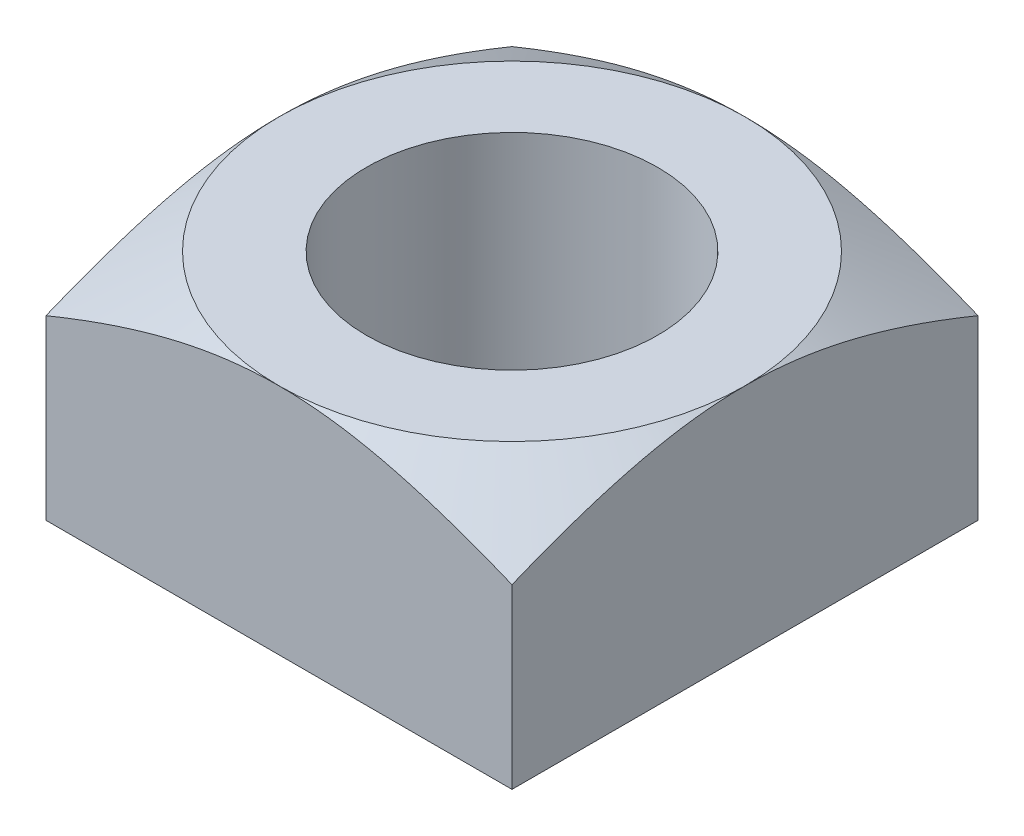
ISO-10303-21;
HEADER;
FILE_DESCRIPTION(('STEP AP214'),'2;1');
FILE_NAME('part.step','',(''),(''),'','','');
FILE_SCHEMA(('AUTOMOTIVE_DESIGN { 1 0 10303 214 1 1 1 1 }'));
ENDSEC;
DATA;
#1=APPLICATION_CONTEXT('core data for automotive mechanical design processes');
#2=APPLICATION_PROTOCOL_DEFINITION('international standard','automotive_design',2000,#1);
#3=PRODUCT_CONTEXT('',#1,'mechanical');
#4=PRODUCT('Part','Part','',(#3));
#5=PRODUCT_RELATED_PRODUCT_CATEGORY('part','',(#4));
#6=PRODUCT_DEFINITION_FORMATION('','',#4);
#7=PRODUCT_DEFINITION_CONTEXT('part definition',#1,'design');
#8=PRODUCT_DEFINITION('design','',#6,#7);
#9=PRODUCT_DEFINITION_SHAPE('','',#8);
#10=(LENGTH_UNIT() NAMED_UNIT(*) SI_UNIT(.MILLI.,.METRE.));
#11=(NAMED_UNIT(*) PLANE_ANGLE_UNIT() SI_UNIT($,.RADIAN.));
#12=(NAMED_UNIT(*) SI_UNIT($,.STERADIAN.) SOLID_ANGLE_UNIT());
#13=UNCERTAINTY_MEASURE_WITH_UNIT(LENGTH_MEASURE(1.E-05),#10,'distance_accuracy_value','');
#14=(GEOMETRIC_REPRESENTATION_CONTEXT(3) GLOBAL_UNCERTAINTY_ASSIGNED_CONTEXT((#13)) GLOBAL_UNIT_ASSIGNED_CONTEXT((#10,
#11,#12)) REPRESENTATION_CONTEXT('',''));
#15=CARTESIAN_POINT('',(0.,0.,0.));
#16=DIRECTION('',(0.,0.,1.));
#17=DIRECTION('',(1.,0.,0.));
#18=AXIS2_PLACEMENT_3D('',#15,#16,#17);
#19=CARTESIAN_POINT('',(-4.,2.,4.));
#20=DIRECTION('',(0.,1.,0.));
#21=DIRECTION('',(0.,0.,1.));
#22=AXIS2_PLACEMENT_3D('',#19,#20,#21);
#23=PLANE('',#22);
#24=CARTESIAN_POINT('',(0.,2.,0.));
#25=DIRECTION('',(0.,1.,0.));
#26=DIRECTION('',(0.,0.,1.));
#27=AXIS2_PLACEMENT_3D('',#24,#25,#26);
#28=CIRCLE('',#27,2.5);
#29=CARTESIAN_POINT('',(0.,2.,2.5));
#30=VERTEX_POINT('',#29);
#31=EDGE_CURVE('E171',#30,#30,#28,.T.);
#32=ORIENTED_EDGE('',*,*,#31,.F.);
#33=EDGE_LOOP('',(#32));
#34=FACE_BOUND('',#33,.T.);
#35=CARTESIAN_POINT('',(0.,2.,0.));
#36=DIRECTION('',(0.,1.,0.));
#37=DIRECTION('',(0.,0.,1.));
#38=AXIS2_PLACEMENT_3D('',#35,#36,#37);
#39=CIRCLE('',#38,4.);
#40=CARTESIAN_POINT('',(-4.,2.,0.));
#41=VERTEX_POINT('',#40);
#42=CARTESIAN_POINT('',(0.,2.,4.));
#43=VERTEX_POINT('',#42);
#44=EDGE_CURVE('E91',#41,#43,#39,.T.);
#45=ORIENTED_EDGE('',*,*,#44,.T.);
#46=CARTESIAN_POINT('',(4.,2.,0.));
#47=VERTEX_POINT('',#46);
#48=EDGE_CURVE('E104',#43,#47,#39,.T.);
#49=ORIENTED_EDGE('',*,*,#48,.T.);
#50=CARTESIAN_POINT('',(0.,2.,-4.));
#51=VERTEX_POINT('',#50);
#52=EDGE_CURVE('E55',#47,#51,#39,.T.);
#53=ORIENTED_EDGE('',*,*,#52,.T.);
#54=EDGE_CURVE('E102',#51,#41,#39,.T.);
#55=ORIENTED_EDGE('',*,*,#54,.T.);
#56=EDGE_LOOP('',(#45,#49,#53,#55));
#57=FACE_BOUND('',#56,.T.);
#58=ADVANCED_FACE('F34',(#34,#57),#23,.T.);
#59=CARTESIAN_POINT('',(-4.,2.,-4.));
#60=DIRECTION('',(1.,0.,0.));
#61=DIRECTION('',(0.,0.,-1.));
#62=AXIS2_PLACEMENT_3D('',#59,#60,#61);
#63=PLANE('',#62);
#64=CARTESIAN_POINT('',(-4.,-0.879608531474339,-8.04844470335721));
#65=CARTESIAN_POINT('',(-4.,-0.778376701369592,-7.85261592056263));
#66=CARTESIAN_POINT('',(-4.,-0.677698114220098,-7.65649840863444));
#67=CARTESIAN_POINT('',(-4.,-0.477741963836189,-7.26353623014899));
#68=CARTESIAN_POINT('',(-4.,-0.37846448419485,-7.06669152108224));
#69=CARTESIAN_POINT('',(-4.,-0.181400070838561,-6.6717133201506));
#70=CARTESIAN_POINT('',(-4.,-0.0836169082704405,-6.47357794319027));
#71=CARTESIAN_POINT('',(-4.,0.109812034269089,-6.07627012713316));
#72=CARTESIAN_POINT('',(-4.,0.205457860585533,-5.87709771063875));
#73=CARTESIAN_POINT('',(-4.,0.399409356430036,-5.4661603663151));
#74=CARTESIAN_POINT('',(-4.,0.497558644796761,-5.25432139860768));
#75=CARTESIAN_POINT('',(-4.,0.689977135565198,-4.82889037773953));
#76=CARTESIAN_POINT('',(-4.,0.784246474471973,-4.61529838657165));
#77=CARTESIAN_POINT('',(-4.,0.967619358116517,-4.18609032729127));
#78=CARTESIAN_POINT('',(-4.,1.05672683142684,-3.9704759475457));
#79=CARTESIAN_POINT('',(-4.,1.22814880888423,-3.53657908239381));
#80=CARTESIAN_POINT('',(-4.,1.31046434544991,-3.31829700830738));
#81=CARTESIAN_POINT('',(-4.,1.46507491133827,-2.88099068520034));
#82=CARTESIAN_POINT('',(-4.,1.53747418675627,-2.66200376564764));
#83=CARTESIAN_POINT('',(-4.,1.67030446821941,-2.22036511787923));
#84=CARTESIAN_POINT('',(-4.,1.73073501671771,-1.9977132499102));
#85=CARTESIAN_POINT('',(-4.,1.83475405028804,-1.55305317277863));
#86=CARTESIAN_POINT('',(-4.,1.87865359831472,-1.33112023441745));
#87=CARTESIAN_POINT('',(-4.,1.93028974853736,-0.996056175139629));
#88=CARTESIAN_POINT('',(-4.,1.94513315761965,-0.884004148426962));
#89=CARTESIAN_POINT('',(-4.,1.96970161537044,-0.65934524594728));
#90=CARTESIAN_POINT('',(-4.,1.97942719778781,-0.546738429277365));
#91=CARTESIAN_POINT('',(-4.,1.99506673996849,-0.295543207308193));
#92=CARTESIAN_POINT('',(-4.,1.99961194835245,-0.156866727763163));
#93=CARTESIAN_POINT('',(-4.,2.00034035778429,0.120511009690021));
#94=CARTESIAN_POINT('',(-4.,1.99652325333162,0.259212268318327));
#95=CARTESIAN_POINT('',(-4.,1.98070472899033,0.536169638038163));
#96=CARTESIAN_POINT('',(-4.,1.96870164439033,0.674425652837391));
#97=CARTESIAN_POINT('',(-4.,1.93703631512156,0.950050352308859));
#98=CARTESIAN_POINT('',(-4.,1.91737381357289,1.08741900706391));
#99=CARTESIAN_POINT('',(-4.,1.87050134979361,1.36484136719974));
#100=CARTESIAN_POINT('',(-4.,1.84309394385382,1.50486135967658));
#101=CARTESIAN_POINT('',(-4.,1.78193523290573,1.78349774950432));
#102=CARTESIAN_POINT('',(-4.,1.74818376311245,1.92211411029776));
#103=CARTESIAN_POINT('',(-4.,1.67526235990367,2.19797968288363));
#104=CARTESIAN_POINT('',(-4.,1.63608962559682,2.33522814840535));
#105=CARTESIAN_POINT('',(-4.,1.55320237253521,2.60832741297954));
#106=CARTESIAN_POINT('',(-4.,1.50948810915175,2.74417829014716));
#107=CARTESIAN_POINT('',(-4.,1.38125316333318,3.12438990812551));
#108=CARTESIAN_POINT('',(-4.,1.29241881266137,3.36729411498807));
#109=CARTESIAN_POINT('',(-4.,1.1058586112881,3.84968473428652));
#110=CARTESIAN_POINT('',(-4.,1.00813024129503,4.08917015596606));
#111=CARTESIAN_POINT('',(-4.,0.806130641916596,4.56561728677685));
#112=CARTESIAN_POINT('',(-4.,0.701853313168632,4.80257639543188));
#113=CARTESIAN_POINT('',(-4.,0.488546186181498,5.2743029818423));
#114=CARTESIAN_POINT('',(-4.,0.379516895331731,5.50907069034952));
#115=CARTESIAN_POINT('',(-4.,0.157520077786945,5.97765144265674));
#116=CARTESIAN_POINT('',(-4.,0.0445410635400105,6.21145902625167));
#117=CARTESIAN_POINT('',(-4.,-0.184181615923029,6.6777207729866));
#118=CARTESIAN_POINT('',(-4.,-0.29992534116102,6.91017490660669));
#119=CARTESIAN_POINT('',(-4.,-0.533502302055754,7.37387019318965));
#120=CARTESIAN_POINT('',(-4.,-0.651334363961229,7.6051119384375));
#121=CARTESIAN_POINT('',(-4.,-0.888706138440968,8.06671795863904));
#122=CARTESIAN_POINT('',(-4.,-1.0082458624046,8.29708222772734));
#123=CARTESIAN_POINT('',(-4.,-1.33646623253675,8.92502953226765));
#124=CARTESIAN_POINT('',(-4.,-1.54650701473723,9.32190130659233));
#125=CARTESIAN_POINT('',(-4.,-1.96949835553763,10.1141646760743));
#126=CARTESIAN_POINT('',(-4.,-2.18244935296364,10.5095560362915));
#127=CARTESIAN_POINT('',(-4.,-2.60904017286627,11.2965845761741));
#128=CARTESIAN_POINT('',(-4.,-2.82266611728943,11.6882292868062));
#129=CARTESIAN_POINT('',(-4.,-3.25147621645828,12.470575594474));
#130=CARTESIAN_POINT('',(-4.,-3.46666009056688,12.8612773452552));
#131=CARTESIAN_POINT('',(-4.,-3.68240128464964,13.2516683836952));
#132=B_SPLINE_CURVE_WITH_KNOTS('',3,(#64,#65,#66,#67,#68,#69,#70,#71,#72,#73,#74,#75,#76,#77,
#78,#79,#80,#81,#82,#83,#84,#85,#86,#87,#88,#89,#90,#91,#92,#93,#94,#95,#96,#97,#98,#99,#100,
#101,#102,#103,#104,#105,#106,#107,#108,#109,#110,#111,#112,#113,#114,#115,#116,#117,#118,#119,
#120,#121,#122,#123,#124,#125,#126,#127,#128,#129,#130,#131),.UNSPECIFIED.,.F.,.F.,(4,2,2,2,2,2,
2,2,2,2,2,2,2,2,2,2,2,2,2,2,2,2,2,2,2,2,2,2,2,2,2,2,2,4),(0.,0.661343168308802,1.32272562836984,
1.985567055275,2.64839409545197,3.34877940877759,4.04914005992402,4.74896048430155,
5.4486743346878,6.14035038616788,6.83205287430585,7.50999829251007,7.84899036864937,
8.18794708358498,8.60394431678524,9.01995674787483,9.43605380502128,9.85216481834473,
10.2800257864293,10.7078978695981,11.1359918435285,11.5640617586439,12.3397018488667,
13.1155623323486,13.8921564474765,14.6686678441631,15.4476644744296,16.2266780321146,
17.0052668202169,17.7838608035954,19.1309197305573,20.4781840697885,21.8165350573434,
23.1546506796528),.UNSPECIFIED.);
#133=CARTESIAN_POINT('',(-4.,1.0434147530476,-4.));
#134=VERTEX_POINT('',#133);
#135=EDGE_CURVE('E107',#134,#41,#132,.T.);
#136=ORIENTED_EDGE('',*,*,#135,.F.);
#137=DIRECTION('',(0.,-1.,0.));
#138=VECTOR('',#137,1.);
#139=CARTESIAN_POINT('',(-4.,2.,-4.));
#140=LINE('',#139,#138);
#141=CARTESIAN_POINT('',(-4.,-2.,-4.));
#142=VERTEX_POINT('',#141);
#143=EDGE_CURVE('E186',#134,#142,#140,.T.);
#144=ORIENTED_EDGE('',*,*,#143,.T.);
#145=DIRECTION('',(0.,0.,1.));
#146=VECTOR('',#145,1.);
#147=CARTESIAN_POINT('',(-4.,-2.,-4.));
#148=LINE('',#147,#146);
#149=CARTESIAN_POINT('',(-4.,-2.,4.));
#150=VERTEX_POINT('',#149);
#151=EDGE_CURVE('E167',#142,#150,#148,.T.);
#152=ORIENTED_EDGE('',*,*,#151,.T.);
#153=DIRECTION('',(0.,-1.,0.));
#154=VECTOR('',#153,1.);
#155=CARTESIAN_POINT('',(-4.,2.,4.));
#156=LINE('',#155,#154);
#157=CARTESIAN_POINT('',(-4.,1.0434147530476,4.));
#158=VERTEX_POINT('',#157);
#159=EDGE_CURVE('E116',#158,#150,#156,.T.);
#160=ORIENTED_EDGE('',*,*,#159,.F.);
#161=EDGE_CURVE('E95',#41,#158,#132,.T.);
#162=ORIENTED_EDGE('',*,*,#161,.F.);
#163=EDGE_LOOP('',(#136,#144,#152,#160,#162));
#164=FACE_BOUND('',#163,.T.);
#165=ADVANCED_FACE('F36',(#164),#63,.F.);
#166=CARTESIAN_POINT('',(-4.,2.,4.));
#167=DIRECTION('',(0.,0.,-1.));
#168=DIRECTION('',(-1.,0.,0.));
#169=AXIS2_PLACEMENT_3D('',#166,#167,#168);
#170=PLANE('',#169);
#171=CARTESIAN_POINT('',(-8.04844470156781,-0.879608530549183,4.));
#172=CARTESIAN_POINT('',(-7.85261591883502,-0.778376700480839,4.));
#173=CARTESIAN_POINT('',(-7.65649840696866,-0.677698113367712,4.));
#174=CARTESIAN_POINT('',(-7.26353622860698,-0.477741963056383,4.));
#175=CARTESIAN_POINT('',(-7.06669151960217,-0.378464483451256,4.));
#176=CARTESIAN_POINT('',(-6.67171331879484,-0.18140007016729,4.));
#177=CARTESIAN_POINT('',(-6.47357794189689,-0.0836169076352794,4.));
#178=CARTESIAN_POINT('',(-6.07627012596476,0.109812034832434,4.));
#179=CARTESIAN_POINT('',(-5.87709770953298,0.205457861113171,4.));
#180=CARTESIAN_POINT('',(-5.46616036534471,0.399409356881961,4.));
#181=CARTESIAN_POINT('',(-5.25432139771009,0.497558645208806,4.));
#182=CARTESIAN_POINT('',(-4.82889037698832,0.689977135898885,4.));
#183=CARTESIAN_POINT('',(-4.61529838589399,0.784246474767181,4.));
#184=CARTESIAN_POINT('',(-4.18609032676176,0.967619358337052,4.));
#185=CARTESIAN_POINT('',(-3.97047594709078,1.05672683161117,4.));
#186=CARTESIAN_POINT('',(-3.53657908208961,1.2281488089998,4.));
#187=CARTESIAN_POINT('',(-3.31829700807933,1.31046434553291,4.));
#188=CARTESIAN_POINT('',(-2.88099068514766,1.46507491135456,4.));
#189=CARTESIAN_POINT('',(-2.66200376569447,1.53747418673924,4.));
#190=CARTESIAN_POINT('',(-2.22036511812852,1.67030446814736,4.));
#191=CARTESIAN_POINT('',(-1.99771325026244,1.73073501662395,4.));
#192=CARTESIAN_POINT('',(-1.55305317333628,1.83475405016868,4.));
#193=CARTESIAN_POINT('',(-1.33112023507747,1.87865359819101,4.));
#194=CARTESIAN_POINT('',(-0.996056175954076,1.93028974842287,4.));
#195=CARTESIAN_POINT('',(-0.884004149292986,1.94513315751085,4.));
#196=CARTESIAN_POINT('',(-0.659345246916411,1.96970161527854,4.));
#197=CARTESIAN_POINT('',(-0.546738430298025,1.97942719770711,4.));
#198=CARTESIAN_POINT('',(-0.295543208326274,1.99506673992613,4.));
#199=CARTESIAN_POINT('',(-0.156866728726566,1.99961194833174,4.));
#200=CARTESIAN_POINT('',(0.120511008837108,2.00034035780023,4.));
#201=CARTESIAN_POINT('',(0.259212267521226,1.99652325336256,4.));
#202=CARTESIAN_POINT('',(0.536169637353108,1.98070472904406,4.));
#203=CARTESIAN_POINT('',(0.67442565220857,1.96870164445185,4.));
#204=CARTESIAN_POINT('',(0.950050351792286,1.93703631519163,4.));
#205=CARTESIAN_POINT('',(1.08741900660335,1.91737381364372,4.));
#206=CARTESIAN_POINT('',(1.36484136685304,1.87050134985938,4.));
#207=CARTESIAN_POINT('',(1.50486135938769,1.84309394391355,4.));
#208=CARTESIAN_POINT('',(1.78349774932996,1.78193523294769,4.));
#209=CARTESIAN_POINT('',(1.92211411018011,1.74818376314269,4.));
#210=CARTESIAN_POINT('',(2.19797968287849,1.67526235990589,4.));
#211=CARTESIAN_POINT('',(2.335228148456,1.63608962558273,4.));
#212=CARTESIAN_POINT('',(2.60832741314064,1.55320237248503,4.));
#213=CARTESIAN_POINT('',(2.74417829036294,1.50948810908179,4.));
#214=CARTESIAN_POINT('',(3.12438990838354,1.38125316324104,4.));
#215=CARTESIAN_POINT('',(3.36729411523446,1.29241881256944,4.));
#216=CARTESIAN_POINT('',(3.84968473451014,1.10585861119826,4.));
#217=CARTESIAN_POINT('',(4.08917015617857,1.0081302412071,4.));
#218=CARTESIAN_POINT('',(4.56561728696745,0.806130641833619,4.));
#219=CARTESIAN_POINT('',(4.80257639561169,0.701853313088711,4.));
#220=CARTESIAN_POINT('',(5.27430298200084,0.488546186108425,4.));
#221=CARTESIAN_POINT('',(5.50907069049758,0.37951689526245,4.));
#222=CARTESIAN_POINT('',(5.97765144278349,0.157520077726025,4.));
#223=CARTESIAN_POINT('',(6.21145902636758,0.04454106348367,4.));
#224=CARTESIAN_POINT('',(6.677720773081,-0.184181615969853,4.));
#225=CARTESIAN_POINT('',(6.91017490669041,-0.299925341202908,4.));
#226=CARTESIAN_POINT('',(7.37387019325219,-0.533502302087546,4.));
#227=CARTESIAN_POINT('',(7.60511193848955,-0.651334363987863,4.));
#228=CARTESIAN_POINT('',(8.06671795867017,-0.888706138457108,4.));
#229=CARTESIAN_POINT('',(8.29708222774807,-1.0082458624154,4.));
#230=CARTESIAN_POINT('',(8.92502953225951,-1.33646623253254,4.));
#231=CARTESIAN_POINT('',(9.3219013065658,-1.54650701472321,4.));
#232=CARTESIAN_POINT('',(10.1141646760112,-1.96949835550375,4.));
#233=CARTESIAN_POINT('',(10.50955603621,-2.18244935291971,4.));
#234=CARTESIAN_POINT('',(11.2965845760575,-2.60904017280282,4.));
#235=CARTESIAN_POINT('',(11.6882292866726,-2.82266611721652,4.));
#236=CARTESIAN_POINT('',(12.4705755943068,-3.25147621636638,4.));
#237=CARTESIAN_POINT('',(12.8612773450711,-3.46666009046545,4.));
#238=CARTESIAN_POINT('',(13.2516683834944,-3.68240128453865,4.));
#239=B_SPLINE_CURVE_WITH_KNOTS('',3,(#171,#172,#173,#174,#175,#176,#177,#178,#179,#180,#181,
#182,#183,#184,#185,#186,#187,#188,#189,#190,#191,#192,#193,#194,#195,#196,#197,#198,#199,#200,
#201,#202,#203,#204,#205,#206,#207,#208,#209,#210,#211,#212,#213,#214,#215,#216,#217,#218,#219,
#220,#221,#222,#223,#224,#225,#226,#227,#228,#229,#230,#231,#232,#233,#234,#235,#236,#237,#238),
.UNSPECIFIED.,.F.,.F.,(4,2,2,2,2,2,2,2,2,2,2,2,2,2,2,2,2,2,2,2,2,2,2,2,2,2,2,2,2,2,2,2,2,4),(0.,
0.661343168093971,1.32272562794016,1.98556705462959,2.64839409459084,3.34877940766797,
4.04914005856593,4.74896048269525,5.44867433283339,6.14035038399899,6.8320528718225,
7.50999828972423,7.84899036571255,8.18794708049727,8.6039443138633,9.01995674511871,
9.43605380243087,9.85216481592007,10.2800257841781,10.7078978675203,11.135991841625,
11.5640617569147,12.3397018471045,13.1155623305535,13.8921564456481,14.6686678423014,
15.4476644725326,16.2266780301824,17.0052668182495,17.783860801593,19.1309197284924,
20.478184067661,21.8165350551579,23.1546506774093),.UNSPECIFIED.);
#240=EDGE_CURVE('E97',#158,#43,#239,.T.);
#241=ORIENTED_EDGE('',*,*,#240,.F.);
#242=ORIENTED_EDGE('',*,*,#159,.T.);
#243=DIRECTION('',(1.,0.,0.));
#244=VECTOR('',#243,1.);
#245=CARTESIAN_POINT('',(-4.,-2.,4.));
#246=LINE('',#245,#244);
#247=CARTESIAN_POINT('',(4.,-2.,4.));
#248=VERTEX_POINT('',#247);
#249=EDGE_CURVE('E177',#150,#248,#246,.T.);
#250=ORIENTED_EDGE('',*,*,#249,.T.);
#251=DIRECTION('',(0.,-1.,0.));
#252=VECTOR('',#251,1.);
#253=CARTESIAN_POINT('',(4.,2.,4.));
#254=LINE('',#253,#252);
#255=CARTESIAN_POINT('',(4.,1.0434147530476,4.));
#256=VERTEX_POINT('',#255);
#257=EDGE_CURVE('E190',#256,#248,#254,.T.);
#258=ORIENTED_EDGE('',*,*,#257,.F.);
#259=EDGE_CURVE('E126',#43,#256,#239,.T.);
#260=ORIENTED_EDGE('',*,*,#259,.F.);
#261=EDGE_LOOP('',(#241,#242,#250,#258,#260));
#262=FACE_BOUND('',#261,.T.);
#263=ADVANCED_FACE('F137',(#262),#170,.F.);
#264=CARTESIAN_POINT('',(4.,2.,-4.));
#265=DIRECTION('',(-1.,0.,0.));
#266=DIRECTION('',(0.,0.,1.));
#267=AXIS2_PLACEMENT_3D('',#264,#265,#266);
#268=PLANE('',#267);
#269=CARTESIAN_POINT('',(4.,-0.879608530549184,-8.04844470156781));
#270=CARTESIAN_POINT('',(4.,-0.778376700480838,-7.85261591883502));
#271=CARTESIAN_POINT('',(4.,-0.677698113367711,-7.65649840696866));
#272=CARTESIAN_POINT('',(4.,-0.477741963056383,-7.26353622860698));
#273=CARTESIAN_POINT('',(4.,-0.378464483451256,-7.06669151960217));
#274=CARTESIAN_POINT('',(4.,-0.18140007016729,-6.67171331879484));
#275=CARTESIAN_POINT('',(4.,-0.0836169076352784,-6.47357794189689));
#276=CARTESIAN_POINT('',(4.,0.109812034832435,-6.07627012596476));
#277=CARTESIAN_POINT('',(4.,0.205457861113171,-5.87709770953297));
#278=CARTESIAN_POINT('',(4.,0.399409356881961,-5.4661603653447));
#279=CARTESIAN_POINT('',(4.,0.497558645208807,-5.25432139771009));
#280=CARTESIAN_POINT('',(4.,0.689977135898885,-4.82889037698832));
#281=CARTESIAN_POINT('',(4.,0.784246474767182,-4.61529838589399));
#282=CARTESIAN_POINT('',(4.,0.967619358337052,-4.18609032676176));
#283=CARTESIAN_POINT('',(4.,1.05672683161118,-3.97047594709078));
#284=CARTESIAN_POINT('',(4.,1.2281488089998,-3.53657908208961));
#285=CARTESIAN_POINT('',(4.,1.31046434553291,-3.31829700807933));
#286=CARTESIAN_POINT('',(4.,1.46507491135456,-2.88099068514766));
#287=CARTESIAN_POINT('',(4.,1.53747418673924,-2.66200376569447));
#288=CARTESIAN_POINT('',(4.,1.67030446814736,-2.22036511812852));
#289=CARTESIAN_POINT('',(4.,1.73073501662395,-1.99771325026244));
#290=CARTESIAN_POINT('',(4.,1.83475405016868,-1.55305317333629));
#291=CARTESIAN_POINT('',(4.,1.87865359819101,-1.33112023507747));
#292=CARTESIAN_POINT('',(4.,1.93028974842287,-0.996056175954077));
#293=CARTESIAN_POINT('',(4.,1.94513315751085,-0.884004149292988));
#294=CARTESIAN_POINT('',(4.,1.96970161527854,-0.659345246916412));
#295=CARTESIAN_POINT('',(4.,1.97942719770711,-0.546738430298025));
#296=CARTESIAN_POINT('',(4.,1.99506673992613,-0.295543208326274));
#297=CARTESIAN_POINT('',(4.,1.99961194833174,-0.156866728726566));
#298=CARTESIAN_POINT('',(4.,2.00034035780023,0.120511008837109));
#299=CARTESIAN_POINT('',(4.,1.99652325336255,0.259212267521226));
#300=CARTESIAN_POINT('',(4.,1.98070472904406,0.536169637353107));
#301=CARTESIAN_POINT('',(4.,1.96870164445185,0.674425652208569));
#302=CARTESIAN_POINT('',(4.,1.93703631519163,0.950050351792285));
#303=CARTESIAN_POINT('',(4.,1.91737381364372,1.08741900660335));
#304=CARTESIAN_POINT('',(4.,1.87050134985938,1.36484136685304));
#305=CARTESIAN_POINT('',(4.,1.84309394391355,1.50486135938769));
#306=CARTESIAN_POINT('',(4.,1.78193523294769,1.78349774932995));
#307=CARTESIAN_POINT('',(4.,1.74818376314268,1.92211411018011));
#308=CARTESIAN_POINT('',(4.,1.67526235990589,2.19797968287849));
#309=CARTESIAN_POINT('',(4.,1.63608962558273,2.335228148456));
#310=CARTESIAN_POINT('',(4.,1.55320237248503,2.60832741314064));
#311=CARTESIAN_POINT('',(4.,1.50948810908179,2.74417829036293));
#312=CARTESIAN_POINT('',(4.,1.38125316324104,3.12438990838354));
#313=CARTESIAN_POINT('',(4.,1.29241881256944,3.36729411523446));
#314=CARTESIAN_POINT('',(4.,1.10585861119826,3.84968473451014));
#315=CARTESIAN_POINT('',(4.,1.0081302412071,4.08917015617857));
#316=CARTESIAN_POINT('',(4.,0.806130641833618,4.56561728696745));
#317=CARTESIAN_POINT('',(4.,0.70185331308871,4.80257639561169));
#318=CARTESIAN_POINT('',(4.,0.488546186108424,5.27430298200084));
#319=CARTESIAN_POINT('',(4.,0.379516895262449,5.50907069049758));
#320=CARTESIAN_POINT('',(4.,0.157520077726024,5.97765144278349));
#321=CARTESIAN_POINT('',(4.,0.044541063483669,6.21145902636758));
#322=CARTESIAN_POINT('',(4.,-0.184181615969855,6.677720773081));
#323=CARTESIAN_POINT('',(4.,-0.29992534120291,6.91017490669041));
#324=CARTESIAN_POINT('',(4.,-0.533502302087549,7.3738701932522));
#325=CARTESIAN_POINT('',(4.,-0.651334363987866,7.60511193848955));
#326=CARTESIAN_POINT('',(4.,-0.88870613845711,8.06671795867018));
#327=CARTESIAN_POINT('',(4.,-1.0082458624154,8.29708222774807));
#328=CARTESIAN_POINT('',(4.,-1.33646623253254,8.92502953225951));
#329=CARTESIAN_POINT('',(4.,-1.54650701472322,9.32190130656581));
#330=CARTESIAN_POINT('',(4.,-1.96949835550375,10.1141646760112));
#331=CARTESIAN_POINT('',(4.,-2.18244935291972,10.50955603621));
#332=CARTESIAN_POINT('',(4.,-2.60904017280282,11.2965845760575));
#333=CARTESIAN_POINT('',(4.,-2.82266611721652,11.6882292866726));
#334=CARTESIAN_POINT('',(4.,-3.25147621636638,12.4705755943068));
#335=CARTESIAN_POINT('',(4.,-3.46666009046545,12.8612773450711));
#336=CARTESIAN_POINT('',(4.,-3.68240128453865,13.2516683834944));
#337=B_SPLINE_CURVE_WITH_KNOTS('',3,(#269,#270,#271,#272,#273,#274,#275,#276,#277,#278,#279,
#280,#281,#282,#283,#284,#285,#286,#287,#288,#289,#290,#291,#292,#293,#294,#295,#296,#297,#298,
#299,#300,#301,#302,#303,#304,#305,#306,#307,#308,#309,#310,#311,#312,#313,#314,#315,#316,#317,
#318,#319,#320,#321,#322,#323,#324,#325,#326,#327,#328,#329,#330,#331,#332,#333,#334,#335,#336),
.UNSPECIFIED.,.F.,.F.,(4,2,2,2,2,2,2,2,2,2,2,2,2,2,2,2,2,2,2,2,2,2,2,2,2,2,2,2,2,2,2,2,2,4),(0.,
0.661343168093971,1.32272562794016,1.9855670546296,2.64839409459084,3.34877940766797,
4.04914005856593,4.74896048269525,5.44867433283339,6.14035038399899,6.8320528718225,
7.50999828972423,7.84899036571255,8.18794708049727,8.6039443138633,9.01995674511871,
9.43605380243088,9.85216481592008,10.2800257841781,10.7078978675203,11.135991841625,
11.5640617569147,12.3397018471045,13.1155623305535,13.8921564456481,14.6686678423014,
15.4476644725326,16.2266780301824,17.0052668182495,17.783860801593,19.1309197284924,
20.478184067661,21.8165350551579,23.1546506774093),.UNSPECIFIED.);
#338=EDGE_CURVE('E125',#256,#47,#337,.F.);
#339=ORIENTED_EDGE('',*,*,#338,.F.);
#340=ORIENTED_EDGE('',*,*,#257,.T.);
#341=DIRECTION('',(0.,0.,-1.));
#342=VECTOR('',#341,1.);
#343=CARTESIAN_POINT('',(4.,-2.,-4.));
#344=LINE('',#343,#342);
#345=CARTESIAN_POINT('',(4.,-2.,-4.));
#346=VERTEX_POINT('',#345);
#347=EDGE_CURVE('E180',#248,#346,#344,.T.);
#348=ORIENTED_EDGE('',*,*,#347,.T.);
#349=DIRECTION('',(0.,-1.,0.));
#350=VECTOR('',#349,1.);
#351=CARTESIAN_POINT('',(4.,2.,-4.));
#352=LINE('',#351,#350);
#353=CARTESIAN_POINT('',(4.,1.0434147530476,-4.));
#354=VERTEX_POINT('',#353);
#355=EDGE_CURVE('E188',#354,#346,#352,.T.);
#356=ORIENTED_EDGE('',*,*,#355,.F.);
#357=EDGE_CURVE('E118',#47,#354,#337,.F.);
#358=ORIENTED_EDGE('',*,*,#357,.F.);
#359=EDGE_LOOP('',(#339,#340,#348,#356,#358));
#360=FACE_BOUND('',#359,.T.);
#361=ADVANCED_FACE('F133',(#360),#268,.F.);
#362=CARTESIAN_POINT('',(-4.,2.,-4.));
#363=DIRECTION('',(0.,0.,1.));
#364=DIRECTION('',(1.,0.,0.));
#365=AXIS2_PLACEMENT_3D('',#362,#363,#364);
#366=PLANE('',#365);
#367=CARTESIAN_POINT('',(-8.04844470156781,-0.879608530549184,-4.));
#368=CARTESIAN_POINT('',(-7.85261591883502,-0.778376700480839,-4.));
#369=CARTESIAN_POINT('',(-7.65649840696866,-0.677698113367711,-4.));
#370=CARTESIAN_POINT('',(-7.26353622860698,-0.477741963056383,-4.));
#371=CARTESIAN_POINT('',(-7.06669151960217,-0.378464483451256,-4.));
#372=CARTESIAN_POINT('',(-6.67171331879484,-0.181400070167291,-4.));
#373=CARTESIAN_POINT('',(-6.47357794189689,-0.0836169076352795,-4.));
#374=CARTESIAN_POINT('',(-6.07627012596476,0.109812034832434,-4.));
#375=CARTESIAN_POINT('',(-5.87709770953297,0.205457861113171,-4.));
#376=CARTESIAN_POINT('',(-5.4661603653447,0.399409356881962,-4.));
#377=CARTESIAN_POINT('',(-5.25432139771009,0.497558645208806,-4.));
#378=CARTESIAN_POINT('',(-4.82889037698832,0.689977135898885,-4.));
#379=CARTESIAN_POINT('',(-4.61529838589399,0.784246474767181,-4.));
#380=CARTESIAN_POINT('',(-4.18609032676176,0.967619358337052,-4.));
#381=CARTESIAN_POINT('',(-3.97047594709078,1.05672683161117,-4.));
#382=CARTESIAN_POINT('',(-3.53657908208961,1.2281488089998,-4.));
#383=CARTESIAN_POINT('',(-3.31829700807933,1.31046434553291,-4.));
#384=CARTESIAN_POINT('',(-2.88099068514766,1.46507491135456,-4.));
#385=CARTESIAN_POINT('',(-2.66200376569447,1.53747418673924,-4.));
#386=CARTESIAN_POINT('',(-2.22036511812852,1.67030446814736,-4.));
#387=CARTESIAN_POINT('',(-1.99771325026244,1.73073501662395,-4.));
#388=CARTESIAN_POINT('',(-1.55305317333629,1.83475405016868,-4.));
#389=CARTESIAN_POINT('',(-1.33112023507747,1.87865359819101,-4.));
#390=CARTESIAN_POINT('',(-0.996056175954077,1.93028974842287,-4.));
#391=CARTESIAN_POINT('',(-0.884004149292988,1.94513315751085,-4.));
#392=CARTESIAN_POINT('',(-0.659345246916412,1.96970161527854,-4.));
#393=CARTESIAN_POINT('',(-0.546738430298025,1.97942719770711,-4.));
#394=CARTESIAN_POINT('',(-0.295543208326274,1.99506673992613,-4.));
#395=CARTESIAN_POINT('',(-0.156866728726565,1.99961194833174,-4.));
#396=CARTESIAN_POINT('',(0.12051100883711,2.00034035780023,-4.));
#397=CARTESIAN_POINT('',(0.259212267521227,1.99652325336256,-4.));
#398=CARTESIAN_POINT('',(0.536169637353107,1.98070472904406,-4.));
#399=CARTESIAN_POINT('',(0.674425652208568,1.96870164445185,-4.));
#400=CARTESIAN_POINT('',(0.950050351792284,1.93703631519163,-4.));
#401=CARTESIAN_POINT('',(1.08741900660335,1.91737381364372,-4.));
#402=CARTESIAN_POINT('',(1.36484136685303,1.87050134985938,-4.));
#403=CARTESIAN_POINT('',(1.50486135938769,1.84309394391355,-4.));
#404=CARTESIAN_POINT('',(1.78349774932995,1.78193523294769,-4.));
#405=CARTESIAN_POINT('',(1.92211411018011,1.74818376314269,-4.));
#406=CARTESIAN_POINT('',(2.19797968287849,1.67526235990589,-4.));
#407=CARTESIAN_POINT('',(2.335228148456,1.63608962558273,-4.));
#408=CARTESIAN_POINT('',(2.60832741314064,1.55320237248503,-4.));
#409=CARTESIAN_POINT('',(2.74417829036293,1.50948810908179,-4.));
#410=CARTESIAN_POINT('',(3.12438990838354,1.38125316324104,-4.));
#411=CARTESIAN_POINT('',(3.36729411523446,1.29241881256944,-4.));
#412=CARTESIAN_POINT('',(3.84968473451014,1.10585861119826,-4.));
#413=CARTESIAN_POINT('',(4.08917015617857,1.0081302412071,-4.));
#414=CARTESIAN_POINT('',(4.56561728696745,0.80613064183362,-4.));
#415=CARTESIAN_POINT('',(4.80257639561168,0.701853313088713,-4.));
#416=CARTESIAN_POINT('',(5.27430298200083,0.488546186108427,-4.));
#417=CARTESIAN_POINT('',(5.50907069049758,0.379516895262452,-4.));
#418=CARTESIAN_POINT('',(5.97765144278348,0.157520077726026,-4.));
#419=CARTESIAN_POINT('',(6.21145902636758,0.044541063483671,-4.));
#420=CARTESIAN_POINT('',(6.677720773081,-0.184181615969853,-4.));
#421=CARTESIAN_POINT('',(6.91017490669041,-0.299925341202908,-4.));
#422=CARTESIAN_POINT('',(7.37387019325219,-0.533502302087546,-4.));
#423=CARTESIAN_POINT('',(7.60511193848955,-0.651334363987862,-4.));
#424=CARTESIAN_POINT('',(8.06671795867017,-0.888706138457107,-4.));
#425=CARTESIAN_POINT('',(8.29708222774806,-1.0082458624154,-4.));
#426=CARTESIAN_POINT('',(8.9250295322595,-1.33646623253254,-4.));
#427=CARTESIAN_POINT('',(9.3219013065658,-1.54650701472321,-4.));
#428=CARTESIAN_POINT('',(10.1141646760112,-1.96949835550375,-4.));
#429=CARTESIAN_POINT('',(10.50955603621,-2.18244935291971,-4.));
#430=CARTESIAN_POINT('',(11.2965845760575,-2.60904017280282,-4.));
#431=CARTESIAN_POINT('',(11.6882292866726,-2.82266611721652,-4.));
#432=CARTESIAN_POINT('',(12.4705755943068,-3.25147621636638,-4.));
#433=CARTESIAN_POINT('',(12.8612773450711,-3.46666009046545,-4.));
#434=CARTESIAN_POINT('',(13.2516683834944,-3.68240128453865,-4.));
#435=B_SPLINE_CURVE_WITH_KNOTS('',3,(#367,#368,#369,#370,#371,#372,#373,#374,#375,#376,#377,
#378,#379,#380,#381,#382,#383,#384,#385,#386,#387,#388,#389,#390,#391,#392,#393,#394,#395,#396,
#397,#398,#399,#400,#401,#402,#403,#404,#405,#406,#407,#408,#409,#410,#411,#412,#413,#414,#415,
#416,#417,#418,#419,#420,#421,#422,#423,#424,#425,#426,#427,#428,#429,#430,#431,#432,#433,#434),
.UNSPECIFIED.,.F.,.F.,(4,2,2,2,2,2,2,2,2,2,2,2,2,2,2,2,2,2,2,2,2,2,2,2,2,2,2,2,2,2,2,2,2,4),(0.,
0.661343168093971,1.32272562794016,1.9855670546296,2.64839409459084,3.34877940766797,
4.04914005856593,4.74896048269525,5.44867433283339,6.14035038399899,6.8320528718225,
7.50999828972423,7.84899036571255,8.18794708049727,8.6039443138633,9.01995674511871,
9.43605380243087,9.85216481592008,10.2800257841781,10.7078978675203,11.135991841625,
11.5640617569147,12.3397018471045,13.1155623305535,13.8921564456481,14.6686678423014,
15.4476644725326,16.2266780301824,17.0052668182495,17.783860801593,19.1309197284924,
20.478184067661,21.8165350551579,23.1546506774093),.UNSPECIFIED.);
#436=EDGE_CURVE('E12',#354,#51,#435,.F.);
#437=ORIENTED_EDGE('',*,*,#436,.F.);
#438=ORIENTED_EDGE('',*,*,#355,.T.);
#439=DIRECTION('',(-1.,0.,0.));
#440=VECTOR('',#439,1.);
#441=CARTESIAN_POINT('',(-4.,-2.,-4.));
#442=LINE('',#441,#440);
#443=EDGE_CURVE('E183',#346,#142,#442,.T.);
#444=ORIENTED_EDGE('',*,*,#443,.T.);
#445=ORIENTED_EDGE('',*,*,#143,.F.);
#446=EDGE_CURVE('E39',#51,#134,#435,.F.);
#447=ORIENTED_EDGE('',*,*,#446,.F.);
#448=EDGE_LOOP('',(#437,#438,#444,#445,#447));
#449=FACE_BOUND('',#448,.T.);
#450=ADVANCED_FACE('F136',(#449),#366,.F.);
#451=CARTESIAN_POINT('',(-4.,-2.,4.));
#452=DIRECTION('',(0.,1.,0.));
#453=DIRECTION('',(0.,0.,1.));
#454=AXIS2_PLACEMENT_3D('',#451,#452,#453);
#455=PLANE('',#454);
#456=ORIENTED_EDGE('',*,*,#151,.F.);
#457=ORIENTED_EDGE('',*,*,#443,.F.);
#458=ORIENTED_EDGE('',*,*,#347,.F.);
#459=ORIENTED_EDGE('',*,*,#249,.F.);
#460=EDGE_LOOP('',(#456,#457,#458,#459));
#461=FACE_BOUND('',#460,.T.);
#462=CARTESIAN_POINT('',(0.,-2.,0.));
#463=DIRECTION('',(0.,1.,0.));
#464=DIRECTION('',(0.,0.,1.));
#465=AXIS2_PLACEMENT_3D('',#462,#463,#464);
#466=CIRCLE('',#465,2.5);
#467=CARTESIAN_POINT('',(0.,-2.,2.5));
#468=VERTEX_POINT('',#467);
#469=EDGE_CURVE('E112',#468,#468,#466,.T.);
#470=ORIENTED_EDGE('',*,*,#469,.T.);
#471=EDGE_LOOP('',(#470));
#472=FACE_BOUND('',#471,.T.);
#473=ADVANCED_FACE('F154',(#461,#472),#455,.F.);
#474=CARTESIAN_POINT('',(0.,2.,0.));
#475=DIRECTION('',(0.,-1.,0.));
#476=DIRECTION('',(0.,0.,-1.));
#477=AXIS2_PLACEMENT_3D('',#474,#475,#476);
#478=CYLINDRICAL_SURFACE('',#477,2.5);
#479=ORIENTED_EDGE('',*,*,#31,.T.);
#480=EDGE_LOOP('',(#479));
#481=FACE_BOUND('',#480,.T.);
#482=ORIENTED_EDGE('',*,*,#469,.F.);
#483=EDGE_LOOP('',(#482));
#484=FACE_BOUND('',#483,.T.);
#485=ADVANCED_FACE('F153',(#481,#484),#478,.F.);
#486=CARTESIAN_POINT('',(0.,2.,0.));
#487=DIRECTION('',(0.,-1.,0.));
#488=DIRECTION('',(0.,0.,1.));
#489=AXIS2_PLACEMENT_3D('',#486,#487,#488);
#490=CONICAL_SURFACE('',#489,4.,1.0471975511966);
#491=ORIENTED_EDGE('',*,*,#135,.T.);
#492=ORIENTED_EDGE('',*,*,#54,.F.);
#493=ORIENTED_EDGE('',*,*,#446,.T.);
#494=EDGE_LOOP('',(#491,#492,#493));
#495=FACE_BOUND('',#494,.T.);
#496=ADVANCED_FACE('F108',(#495),#490,.T.);
#497=ORIENTED_EDGE('',*,*,#357,.T.);
#498=ORIENTED_EDGE('',*,*,#436,.T.);
#499=ORIENTED_EDGE('',*,*,#52,.F.);
#500=EDGE_LOOP('',(#497,#498,#499));
#501=FACE_BOUND('',#500,.T.);
#502=ADVANCED_FACE('F198',(#501),#490,.T.);
#503=ORIENTED_EDGE('',*,*,#259,.T.);
#504=ORIENTED_EDGE('',*,*,#338,.T.);
#505=ORIENTED_EDGE('',*,*,#48,.F.);
#506=EDGE_LOOP('',(#503,#504,#505));
#507=FACE_BOUND('',#506,.T.);
#508=ADVANCED_FACE('F197',(#507),#490,.T.);
#509=ORIENTED_EDGE('',*,*,#161,.T.);
#510=ORIENTED_EDGE('',*,*,#240,.T.);
#511=ORIENTED_EDGE('',*,*,#44,.F.);
#512=EDGE_LOOP('',(#509,#510,#511));
#513=FACE_BOUND('',#512,.T.);
#514=ADVANCED_FACE('F93',(#513),#490,.T.);
#515=CLOSED_SHELL('',(#58,#165,#263,#361,#450,#473,#485,#496,#502,#508,#514));
#516=MANIFOLD_SOLID_BREP('B2',#515);
#517=ADVANCED_BREP_SHAPE_REPRESENTATION('',(#18,#516),#14);
#518=SHAPE_DEFINITION_REPRESENTATION(#9,#517);
ENDSEC;
END-ISO-10303-21;
